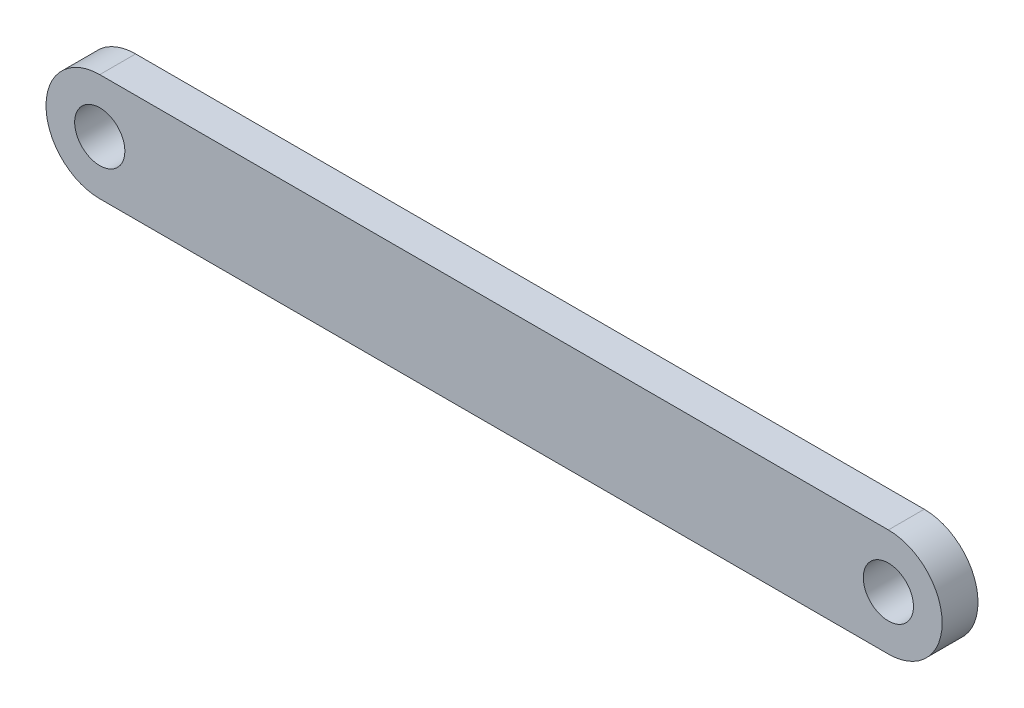
ISO-10303-21;
HEADER;
FILE_DESCRIPTION(('STEP AP214'),'2;1');
FILE_NAME('part.step','',(''),(''),'','','');
FILE_SCHEMA(('AUTOMOTIVE_DESIGN { 1 0 10303 214 1 1 1 1 }'));
ENDSEC;
DATA;
#1=APPLICATION_CONTEXT('core data for automotive mechanical design processes');
#2=APPLICATION_PROTOCOL_DEFINITION('international standard','automotive_design',2000,#1);
#3=PRODUCT_CONTEXT('',#1,'mechanical');
#4=PRODUCT('Part','Part','',(#3));
#5=PRODUCT_RELATED_PRODUCT_CATEGORY('part','',(#4));
#6=PRODUCT_DEFINITION_FORMATION('','',#4);
#7=PRODUCT_DEFINITION_CONTEXT('part definition',#1,'design');
#8=PRODUCT_DEFINITION('design','',#6,#7);
#9=PRODUCT_DEFINITION_SHAPE('','',#8);
#10=(LENGTH_UNIT() NAMED_UNIT(*) SI_UNIT(.MILLI.,.METRE.));
#11=(NAMED_UNIT(*) PLANE_ANGLE_UNIT() SI_UNIT($,.RADIAN.));
#12=(NAMED_UNIT(*) SI_UNIT($,.STERADIAN.) SOLID_ANGLE_UNIT());
#13=UNCERTAINTY_MEASURE_WITH_UNIT(LENGTH_MEASURE(1.E-05),#10,'distance_accuracy_value','');
#14=(GEOMETRIC_REPRESENTATION_CONTEXT(3) GLOBAL_UNCERTAINTY_ASSIGNED_CONTEXT((#13)) GLOBAL_UNIT_ASSIGNED_CONTEXT((#10,
#11,#12)) REPRESENTATION_CONTEXT('',''));
#15=CARTESIAN_POINT('',(0.,0.,0.));
#16=DIRECTION('',(0.,0.,1.));
#17=DIRECTION('',(1.,0.,0.));
#18=AXIS2_PLACEMENT_3D('',#15,#16,#17);
#19=CARTESIAN_POINT('',(-27.94,-3.81,2.54));
#20=DIRECTION('',(0.,0.,-1.));
#21=DIRECTION('',(-1.,0.,0.));
#22=AXIS2_PLACEMENT_3D('',#19,#20,#21);
#23=CYLINDRICAL_SURFACE('',#22,3.81);
#24=CARTESIAN_POINT('',(-27.94,-3.81,0.));
#25=DIRECTION('',(0.,0.,1.));
#26=DIRECTION('',(1.,0.,0.));
#27=AXIS2_PLACEMENT_3D('',#24,#25,#26);
#28=CIRCLE('',#27,3.81);
#29=CARTESIAN_POINT('',(-27.94,0.,0.));
#30=VERTEX_POINT('',#29);
#31=CARTESIAN_POINT('',(-27.94,-7.62,0.));
#32=VERTEX_POINT('',#31);
#33=EDGE_CURVE('E102',#30,#32,#28,.T.);
#34=ORIENTED_EDGE('',*,*,#33,.T.);
#35=DIRECTION('',(0.,0.,-1.));
#36=VECTOR('',#35,1.);
#37=CARTESIAN_POINT('',(-27.94,-7.62,2.54));
#38=LINE('',#37,#36);
#39=CARTESIAN_POINT('',(-27.94,-7.62,2.54));
#40=VERTEX_POINT('',#39);
#41=EDGE_CURVE('E11',#40,#32,#38,.T.);
#42=ORIENTED_EDGE('',*,*,#41,.F.);
#43=CARTESIAN_POINT('',(-27.94,-3.81,2.54));
#44=DIRECTION('',(0.,0.,1.));
#45=DIRECTION('',(1.,0.,0.));
#46=AXIS2_PLACEMENT_3D('',#43,#44,#45);
#47=CIRCLE('',#46,3.81);
#48=CARTESIAN_POINT('',(-27.94,0.,2.54));
#49=VERTEX_POINT('',#48);
#50=EDGE_CURVE('E90',#49,#40,#47,.T.);
#51=ORIENTED_EDGE('',*,*,#50,.F.);
#52=DIRECTION('',(0.,0.,-1.));
#53=VECTOR('',#52,1.);
#54=CARTESIAN_POINT('',(-27.94,0.,2.54));
#55=LINE('',#54,#53);
#56=EDGE_CURVE('E98',#49,#30,#55,.T.);
#57=ORIENTED_EDGE('',*,*,#56,.T.);
#58=EDGE_LOOP('',(#34,#42,#51,#57));
#59=FACE_BOUND('',#58,.T.);
#60=ADVANCED_FACE('F39',(#59),#23,.T.);
#61=CARTESIAN_POINT('',(27.94,-7.62,2.54));
#62=DIRECTION('',(0.,1.,0.));
#63=DIRECTION('',(0.,0.,1.));
#64=AXIS2_PLACEMENT_3D('',#61,#62,#63);
#65=PLANE('',#64);
#66=DIRECTION('',(1.,0.,0.));
#67=VECTOR('',#66,1.);
#68=CARTESIAN_POINT('',(27.94,-7.62,0.));
#69=LINE('',#68,#67);
#70=CARTESIAN_POINT('',(27.94,-7.62,0.));
#71=VERTEX_POINT('',#70);
#72=EDGE_CURVE('E94',#32,#71,#69,.T.);
#73=ORIENTED_EDGE('',*,*,#72,.T.);
#74=DIRECTION('',(0.,0.,-1.));
#75=VECTOR('',#74,1.);
#76=CARTESIAN_POINT('',(27.94,-7.62,2.54));
#77=LINE('',#76,#75);
#78=CARTESIAN_POINT('',(27.94,-7.62,2.54));
#79=VERTEX_POINT('',#78);
#80=EDGE_CURVE('E47',#79,#71,#77,.T.);
#81=ORIENTED_EDGE('',*,*,#80,.F.);
#82=DIRECTION('',(1.,0.,0.));
#83=VECTOR('',#82,1.);
#84=CARTESIAN_POINT('',(27.94,-7.62,2.54));
#85=LINE('',#84,#83);
#86=EDGE_CURVE('E85',#40,#79,#85,.T.);
#87=ORIENTED_EDGE('',*,*,#86,.F.);
#88=ORIENTED_EDGE('',*,*,#41,.T.);
#89=EDGE_LOOP('',(#73,#81,#87,#88));
#90=FACE_BOUND('',#89,.T.);
#91=ADVANCED_FACE('F93',(#90),#65,.F.);
#92=CARTESIAN_POINT('',(27.94,-3.81,2.54));
#93=DIRECTION('',(0.,0.,-1.));
#94=DIRECTION('',(-1.,0.,0.));
#95=AXIS2_PLACEMENT_3D('',#92,#93,#94);
#96=CYLINDRICAL_SURFACE('',#95,3.81);
#97=CARTESIAN_POINT('',(27.94,-3.81,0.));
#98=DIRECTION('',(0.,0.,1.));
#99=DIRECTION('',(1.,0.,0.));
#100=AXIS2_PLACEMENT_3D('',#97,#98,#99);
#101=CIRCLE('',#100,3.81);
#102=CARTESIAN_POINT('',(27.94,0.,0.));
#103=VERTEX_POINT('',#102);
#104=EDGE_CURVE('E72',#71,#103,#101,.T.);
#105=ORIENTED_EDGE('',*,*,#104,.T.);
#106=DIRECTION('',(0.,0.,-1.));
#107=VECTOR('',#106,1.);
#108=CARTESIAN_POINT('',(27.94,0.,2.54));
#109=LINE('',#108,#107);
#110=CARTESIAN_POINT('',(27.94,0.,2.54));
#111=VERTEX_POINT('',#110);
#112=EDGE_CURVE('E95',#111,#103,#109,.T.);
#113=ORIENTED_EDGE('',*,*,#112,.F.);
#114=CARTESIAN_POINT('',(27.94,-3.81,2.54));
#115=DIRECTION('',(0.,0.,1.));
#116=DIRECTION('',(1.,0.,0.));
#117=AXIS2_PLACEMENT_3D('',#114,#115,#116);
#118=CIRCLE('',#117,3.81);
#119=EDGE_CURVE('E88',#79,#111,#118,.T.);
#120=ORIENTED_EDGE('',*,*,#119,.F.);
#121=ORIENTED_EDGE('',*,*,#80,.T.);
#122=EDGE_LOOP('',(#105,#113,#120,#121));
#123=FACE_BOUND('',#122,.T.);
#124=ADVANCED_FACE('F96',(#123),#96,.T.);
#125=CARTESIAN_POINT('',(-27.94,0.,2.54));
#126=DIRECTION('',(0.,-1.,0.));
#127=DIRECTION('',(0.,0.,-1.));
#128=AXIS2_PLACEMENT_3D('',#125,#126,#127);
#129=PLANE('',#128);
#130=DIRECTION('',(-1.,0.,0.));
#131=VECTOR('',#130,1.);
#132=CARTESIAN_POINT('',(-27.94,0.,0.));
#133=LINE('',#132,#131);
#134=EDGE_CURVE('E78',#103,#30,#133,.T.);
#135=ORIENTED_EDGE('',*,*,#134,.T.);
#136=ORIENTED_EDGE('',*,*,#56,.F.);
#137=DIRECTION('',(-1.,0.,0.));
#138=VECTOR('',#137,1.);
#139=CARTESIAN_POINT('',(-27.94,0.,2.54));
#140=LINE('',#139,#138);
#141=EDGE_CURVE('E55',#111,#49,#140,.T.);
#142=ORIENTED_EDGE('',*,*,#141,.F.);
#143=ORIENTED_EDGE('',*,*,#112,.T.);
#144=EDGE_LOOP('',(#135,#136,#142,#143));
#145=FACE_BOUND('',#144,.T.);
#146=ADVANCED_FACE('F110',(#145),#129,.F.);
#147=CARTESIAN_POINT('',(-27.94,-3.81,2.54));
#148=DIRECTION('',(0.,0.,1.));
#149=DIRECTION('',(1.,0.,0.));
#150=AXIS2_PLACEMENT_3D('',#147,#148,#149);
#151=PLANE('',#150);
#152=CARTESIAN_POINT('',(27.94,-3.81,2.54));
#153=DIRECTION('',(0.,0.,-1.));
#154=DIRECTION('',(-1.,0.,0.));
#155=AXIS2_PLACEMENT_3D('',#152,#153,#154);
#156=CIRCLE('',#155,1.778);
#157=CARTESIAN_POINT('',(26.162,-3.81,2.54));
#158=VERTEX_POINT('',#157);
#159=EDGE_CURVE('E122',#158,#158,#156,.T.);
#160=ORIENTED_EDGE('',*,*,#159,.T.);
#161=EDGE_LOOP('',(#160));
#162=FACE_BOUND('',#161,.T.);
#163=CARTESIAN_POINT('',(-27.94,-3.81,2.54));
#164=DIRECTION('',(0.,0.,1.));
#165=DIRECTION('',(1.,0.,0.));
#166=AXIS2_PLACEMENT_3D('',#163,#164,#165);
#167=CIRCLE('',#166,1.778);
#168=CARTESIAN_POINT('',(-26.162,-3.81,2.54));
#169=VERTEX_POINT('',#168);
#170=EDGE_CURVE('E116',#169,#169,#167,.T.);
#171=ORIENTED_EDGE('',*,*,#170,.F.);
#172=EDGE_LOOP('',(#171));
#173=FACE_BOUND('',#172,.T.);
#174=ORIENTED_EDGE('',*,*,#50,.T.);
#175=ORIENTED_EDGE('',*,*,#86,.T.);
#176=ORIENTED_EDGE('',*,*,#119,.T.);
#177=ORIENTED_EDGE('',*,*,#141,.T.);
#178=EDGE_LOOP('',(#174,#175,#176,#177));
#179=FACE_BOUND('',#178,.T.);
#180=ADVANCED_FACE('F86',(#162,#173,#179),#151,.T.);
#181=CARTESIAN_POINT('',(-27.94,-3.81,0.));
#182=DIRECTION('',(0.,0.,1.));
#183=DIRECTION('',(1.,0.,0.));
#184=AXIS2_PLACEMENT_3D('',#181,#182,#183);
#185=PLANE('',#184);
#186=CARTESIAN_POINT('',(27.94,-3.81,0.));
#187=DIRECTION('',(0.,0.,-1.));
#188=DIRECTION('',(-1.,0.,0.));
#189=AXIS2_PLACEMENT_3D('',#186,#187,#188);
#190=CIRCLE('',#189,1.778);
#191=CARTESIAN_POINT('',(26.162,-3.81,0.));
#192=VERTEX_POINT('',#191);
#193=EDGE_CURVE('E119',#192,#192,#190,.T.);
#194=ORIENTED_EDGE('',*,*,#193,.F.);
#195=EDGE_LOOP('',(#194));
#196=FACE_BOUND('',#195,.T.);
#197=CARTESIAN_POINT('',(-27.94,-3.81,0.));
#198=DIRECTION('',(0.,0.,1.));
#199=DIRECTION('',(1.,0.,0.));
#200=AXIS2_PLACEMENT_3D('',#197,#198,#199);
#201=CIRCLE('',#200,1.778);
#202=CARTESIAN_POINT('',(-26.162,-3.81,0.));
#203=VERTEX_POINT('',#202);
#204=EDGE_CURVE('E105',#203,#203,#201,.T.);
#205=ORIENTED_EDGE('',*,*,#204,.T.);
#206=EDGE_LOOP('',(#205));
#207=FACE_BOUND('',#206,.T.);
#208=ORIENTED_EDGE('',*,*,#33,.F.);
#209=ORIENTED_EDGE('',*,*,#134,.F.);
#210=ORIENTED_EDGE('',*,*,#104,.F.);
#211=ORIENTED_EDGE('',*,*,#72,.F.);
#212=EDGE_LOOP('',(#208,#209,#210,#211));
#213=FACE_BOUND('',#212,.T.);
#214=ADVANCED_FACE('F113',(#196,#207,#213),#185,.F.);
#215=CARTESIAN_POINT('',(-27.94,-3.81,0.));
#216=DIRECTION('',(0.,0.,1.));
#217=DIRECTION('',(1.,0.,0.));
#218=AXIS2_PLACEMENT_3D('',#215,#216,#217);
#219=CYLINDRICAL_SURFACE('',#218,1.778);
#220=ORIENTED_EDGE('',*,*,#204,.F.);
#221=EDGE_LOOP('',(#220));
#222=FACE_BOUND('',#221,.T.);
#223=ORIENTED_EDGE('',*,*,#170,.T.);
#224=EDGE_LOOP('',(#223));
#225=FACE_BOUND('',#224,.T.);
#226=ADVANCED_FACE('F133',(#222,#225),#219,.F.);
#227=CARTESIAN_POINT('',(27.94,-3.81,0.));
#228=DIRECTION('',(0.,0.,1.));
#229=DIRECTION('',(1.,0.,0.));
#230=AXIS2_PLACEMENT_3D('',#227,#228,#229);
#231=CYLINDRICAL_SURFACE('',#230,1.778);
#232=ORIENTED_EDGE('',*,*,#193,.T.);
#233=EDGE_LOOP('',(#232));
#234=FACE_BOUND('',#233,.T.);
#235=ORIENTED_EDGE('',*,*,#159,.F.);
#236=EDGE_LOOP('',(#235));
#237=FACE_BOUND('',#236,.T.);
#238=ADVANCED_FACE('F128',(#234,#237),#231,.F.);
#239=CLOSED_SHELL('',(#60,#91,#124,#146,#180,#214,#226,#238));
#240=MANIFOLD_SOLID_BREP('B2',#239);
#241=ADVANCED_BREP_SHAPE_REPRESENTATION('',(#18,#240),#14);
#242=SHAPE_DEFINITION_REPRESENTATION(#9,#241);
ENDSEC;
END-ISO-10303-21;
